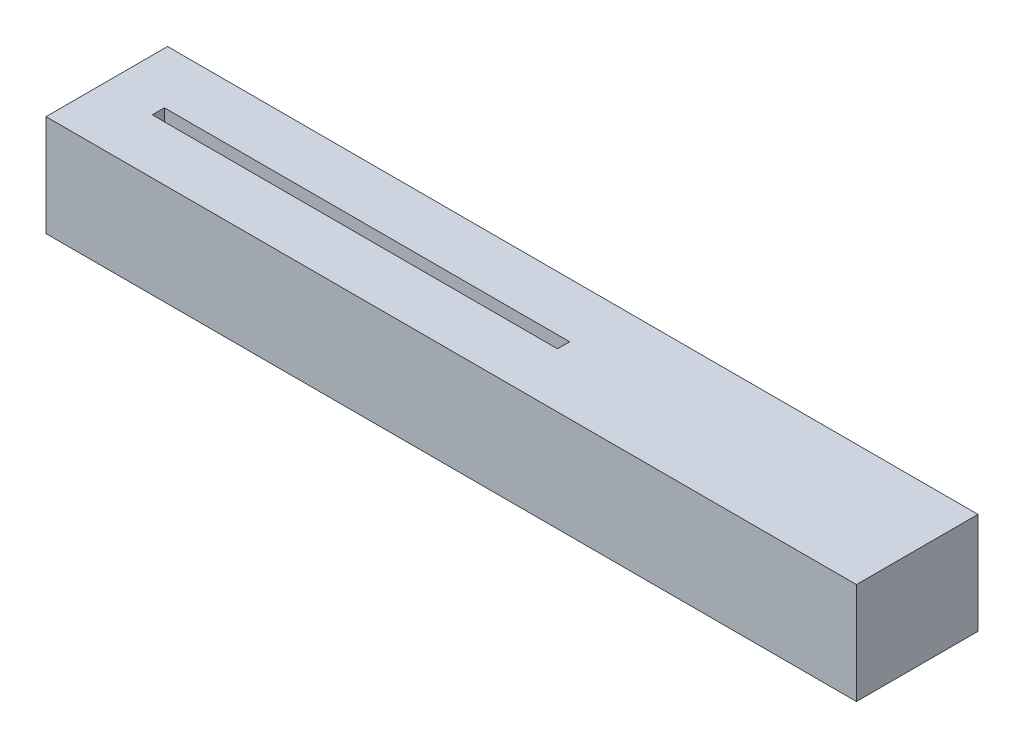
ISO-10303-21;
HEADER;
FILE_DESCRIPTION(('STEP AP214'),'2;1');
FILE_NAME('part.step','',(''),(''),'','','');
FILE_SCHEMA(('AUTOMOTIVE_DESIGN { 1 0 10303 214 1 1 1 1 }'));
ENDSEC;
DATA;
#1=APPLICATION_CONTEXT('core data for automotive mechanical design processes');
#2=APPLICATION_PROTOCOL_DEFINITION('international standard','automotive_design',2000,#1);
#3=PRODUCT_CONTEXT('',#1,'mechanical');
#4=PRODUCT('Part','Part','',(#3));
#5=PRODUCT_RELATED_PRODUCT_CATEGORY('part','',(#4));
#6=PRODUCT_DEFINITION_FORMATION('','',#4);
#7=PRODUCT_DEFINITION_CONTEXT('part definition',#1,'design');
#8=PRODUCT_DEFINITION('design','',#6,#7);
#9=PRODUCT_DEFINITION_SHAPE('','',#8);
#10=(LENGTH_UNIT() NAMED_UNIT(*) SI_UNIT(.MILLI.,.METRE.));
#11=(NAMED_UNIT(*) PLANE_ANGLE_UNIT() SI_UNIT($,.RADIAN.));
#12=(NAMED_UNIT(*) SI_UNIT($,.STERADIAN.) SOLID_ANGLE_UNIT());
#13=UNCERTAINTY_MEASURE_WITH_UNIT(LENGTH_MEASURE(1.E-05),#10,'distance_accuracy_value','');
#14=(GEOMETRIC_REPRESENTATION_CONTEXT(3) GLOBAL_UNCERTAINTY_ASSIGNED_CONTEXT((#13)) GLOBAL_UNIT_ASSIGNED_CONTEXT((#10,
#11,#12)) REPRESENTATION_CONTEXT('',''));
#15=CARTESIAN_POINT('',(0.,0.,0.));
#16=DIRECTION('',(0.,0.,1.));
#17=DIRECTION('',(1.,0.,0.));
#18=AXIS2_PLACEMENT_3D('',#15,#16,#17);
#19=CARTESIAN_POINT('',(0.,5.,0.));
#20=DIRECTION('',(-1.,0.,0.));
#21=DIRECTION('',(0.,0.,1.));
#22=AXIS2_PLACEMENT_3D('',#19,#20,#21);
#23=PLANE('',#22);
#24=DIRECTION('',(0.,0.,-1.));
#25=VECTOR('',#24,1.);
#26=CARTESIAN_POINT('',(0.,0.,0.));
#27=LINE('',#26,#25);
#28=CARTESIAN_POINT('',(0.,0.,0.));
#29=VERTEX_POINT('',#28);
#30=CARTESIAN_POINT('',(0.,0.,-6.));
#31=VERTEX_POINT('',#30);
#32=EDGE_CURVE('E152',#29,#31,#27,.T.);
#33=ORIENTED_EDGE('',*,*,#32,.F.);
#34=DIRECTION('',(0.,-1.,0.));
#35=VECTOR('',#34,1.);
#36=CARTESIAN_POINT('',(0.,5.,0.));
#37=LINE('',#36,#35);
#38=CARTESIAN_POINT('',(0.,5.,0.));
#39=VERTEX_POINT('',#38);
#40=EDGE_CURVE('E11',#39,#29,#37,.T.);
#41=ORIENTED_EDGE('',*,*,#40,.F.);
#42=DIRECTION('',(0.,0.,-1.));
#43=VECTOR('',#42,1.);
#44=CARTESIAN_POINT('',(0.,5.,0.));
#45=LINE('',#44,#43);
#46=CARTESIAN_POINT('',(0.,5.,-6.));
#47=VERTEX_POINT('',#46);
#48=EDGE_CURVE('E122',#39,#47,#45,.T.);
#49=ORIENTED_EDGE('',*,*,#48,.T.);
#50=DIRECTION('',(0.,-1.,0.));
#51=VECTOR('',#50,1.);
#52=CARTESIAN_POINT('',(0.,5.,-6.));
#53=LINE('',#52,#51);
#54=EDGE_CURVE('E56',#47,#31,#53,.T.);
#55=ORIENTED_EDGE('',*,*,#54,.T.);
#56=EDGE_LOOP('',(#33,#41,#49,#55));
#57=FACE_BOUND('',#56,.T.);
#58=ADVANCED_FACE('F37',(#57),#23,.T.);
#59=CARTESIAN_POINT('',(0.,5.,0.));
#60=DIRECTION('',(0.,0.,-1.));
#61=DIRECTION('',(-1.,0.,0.));
#62=AXIS2_PLACEMENT_3D('',#59,#60,#61);
#63=PLANE('',#62);
#64=DIRECTION('',(1.,0.,0.));
#65=VECTOR('',#64,1.);
#66=CARTESIAN_POINT('',(0.,0.,0.));
#67=LINE('',#66,#65);
#68=CARTESIAN_POINT('',(40.,0.,0.));
#69=VERTEX_POINT('',#68);
#70=EDGE_CURVE('E127',#29,#69,#67,.T.);
#71=ORIENTED_EDGE('',*,*,#70,.T.);
#72=DIRECTION('',(0.,-1.,0.));
#73=VECTOR('',#72,1.);
#74=CARTESIAN_POINT('',(40.,5.,0.));
#75=LINE('',#74,#73);
#76=CARTESIAN_POINT('',(40.,5.,0.));
#77=VERTEX_POINT('',#76);
#78=EDGE_CURVE('E47',#77,#69,#75,.T.);
#79=ORIENTED_EDGE('',*,*,#78,.F.);
#80=DIRECTION('',(1.,0.,0.));
#81=VECTOR('',#80,1.);
#82=CARTESIAN_POINT('',(0.,5.,0.));
#83=LINE('',#82,#81);
#84=EDGE_CURVE('E117',#39,#77,#83,.T.);
#85=ORIENTED_EDGE('',*,*,#84,.F.);
#86=ORIENTED_EDGE('',*,*,#40,.T.);
#87=EDGE_LOOP('',(#71,#79,#85,#86));
#88=FACE_BOUND('',#87,.T.);
#89=ADVANCED_FACE('F125',(#88),#63,.F.);
#90=CARTESIAN_POINT('',(40.,5.,0.));
#91=DIRECTION('',(-1.,0.,0.));
#92=DIRECTION('',(0.,0.,1.));
#93=AXIS2_PLACEMENT_3D('',#90,#91,#92);
#94=PLANE('',#93);
#95=DIRECTION('',(0.,0.,-1.));
#96=VECTOR('',#95,1.);
#97=CARTESIAN_POINT('',(40.,0.,0.));
#98=LINE('',#97,#96);
#99=CARTESIAN_POINT('',(40.,0.,-6.));
#100=VERTEX_POINT('',#99);
#101=EDGE_CURVE('E149',#69,#100,#98,.T.);
#102=ORIENTED_EDGE('',*,*,#101,.T.);
#103=DIRECTION('',(0.,-1.,0.));
#104=VECTOR('',#103,1.);
#105=CARTESIAN_POINT('',(40.,5.,-6.));
#106=LINE('',#105,#104);
#107=CARTESIAN_POINT('',(40.,5.,-6.));
#108=VERTEX_POINT('',#107);
#109=EDGE_CURVE('E82',#108,#100,#106,.T.);
#110=ORIENTED_EDGE('',*,*,#109,.F.);
#111=DIRECTION('',(0.,0.,-1.));
#112=VECTOR('',#111,1.);
#113=CARTESIAN_POINT('',(40.,5.,0.));
#114=LINE('',#113,#112);
#115=EDGE_CURVE('E109',#77,#108,#114,.T.);
#116=ORIENTED_EDGE('',*,*,#115,.F.);
#117=ORIENTED_EDGE('',*,*,#78,.T.);
#118=EDGE_LOOP('',(#102,#110,#116,#117));
#119=FACE_BOUND('',#118,.T.);
#120=ADVANCED_FACE('F111',(#119),#94,.F.);
#121=CARTESIAN_POINT('',(0.,5.,-2.7));
#122=DIRECTION('',(0.,0.,-1.));
#123=DIRECTION('',(-1.,0.,0.));
#124=AXIS2_PLACEMENT_3D('',#121,#122,#123);
#125=PLANE('',#124);
#126=DIRECTION('',(1.,0.,0.));
#127=VECTOR('',#126,1.);
#128=CARTESIAN_POINT('',(0.,0.,-2.7));
#129=LINE('',#128,#127);
#130=CARTESIAN_POINT('',(2.54432125608404,0.,-2.7));
#131=VERTEX_POINT('',#130);
#132=CARTESIAN_POINT('',(22.544321256084,0.,-2.7));
#133=VERTEX_POINT('',#132);
#134=EDGE_CURVE('E161',#131,#133,#129,.T.);
#135=ORIENTED_EDGE('',*,*,#134,.F.);
#136=DIRECTION('',(0.,-1.,0.));
#137=VECTOR('',#136,1.);
#138=CARTESIAN_POINT('',(2.54432125608404,5.,-2.7));
#139=LINE('',#138,#137);
#140=CARTESIAN_POINT('',(2.54432125608404,5.,-2.7));
#141=VERTEX_POINT('',#140);
#142=EDGE_CURVE('E41',#141,#131,#139,.T.);
#143=ORIENTED_EDGE('',*,*,#142,.F.);
#144=DIRECTION('',(1.,0.,0.));
#145=VECTOR('',#144,1.);
#146=CARTESIAN_POINT('',(0.,5.,-2.7));
#147=LINE('',#146,#145);
#148=CARTESIAN_POINT('',(22.544321256084,5.,-2.7));
#149=VERTEX_POINT('',#148);
#150=EDGE_CURVE('E148',#141,#149,#147,.T.);
#151=ORIENTED_EDGE('',*,*,#150,.T.);
#152=DIRECTION('',(0.,-1.,0.));
#153=VECTOR('',#152,1.);
#154=CARTESIAN_POINT('',(22.544321256084,5.,-2.7));
#155=LINE('',#154,#153);
#156=EDGE_CURVE('E132',#149,#133,#155,.T.);
#157=ORIENTED_EDGE('',*,*,#156,.T.);
#158=EDGE_LOOP('',(#135,#143,#151,#157));
#159=FACE_BOUND('',#158,.T.);
#160=ADVANCED_FACE('F39',(#159),#125,.T.);
#161=CARTESIAN_POINT('',(2.54432125608404,5.,0.));
#162=DIRECTION('',(-1.,0.,0.));
#163=DIRECTION('',(0.,0.,1.));
#164=AXIS2_PLACEMENT_3D('',#161,#162,#163);
#165=PLANE('',#164);
#166=DIRECTION('',(0.,0.,-1.));
#167=VECTOR('',#166,1.);
#168=CARTESIAN_POINT('',(2.54432125608404,0.,0.));
#169=LINE('',#168,#167);
#170=CARTESIAN_POINT('',(2.54432125608404,0.,-3.3));
#171=VERTEX_POINT('',#170);
#172=EDGE_CURVE('E159',#131,#171,#169,.T.);
#173=ORIENTED_EDGE('',*,*,#172,.T.);
#174=DIRECTION('',(0.,-1.,0.));
#175=VECTOR('',#174,1.);
#176=CARTESIAN_POINT('',(2.54432125608404,5.,-3.3));
#177=LINE('',#176,#175);
#178=CARTESIAN_POINT('',(2.54432125608404,5.,-3.3));
#179=VERTEX_POINT('',#178);
#180=EDGE_CURVE('E135',#179,#171,#177,.T.);
#181=ORIENTED_EDGE('',*,*,#180,.F.);
#182=DIRECTION('',(0.,0.,-1.));
#183=VECTOR('',#182,1.);
#184=CARTESIAN_POINT('',(2.54432125608404,5.,0.));
#185=LINE('',#184,#183);
#186=EDGE_CURVE('E171',#141,#179,#185,.T.);
#187=ORIENTED_EDGE('',*,*,#186,.F.);
#188=ORIENTED_EDGE('',*,*,#142,.T.);
#189=EDGE_LOOP('',(#173,#181,#187,#188));
#190=FACE_BOUND('',#189,.T.);
#191=ADVANCED_FACE('F183',(#190),#165,.F.);
#192=CARTESIAN_POINT('',(0.,5.,-3.3));
#193=DIRECTION('',(0.,0.,-1.));
#194=DIRECTION('',(-1.,0.,0.));
#195=AXIS2_PLACEMENT_3D('',#192,#193,#194);
#196=PLANE('',#195);
#197=DIRECTION('',(1.,0.,0.));
#198=VECTOR('',#197,1.);
#199=CARTESIAN_POINT('',(0.,0.,-3.3));
#200=LINE('',#199,#198);
#201=CARTESIAN_POINT('',(22.544321256084,0.,-3.3));
#202=VERTEX_POINT('',#201);
#203=EDGE_CURVE('E157',#171,#202,#200,.T.);
#204=ORIENTED_EDGE('',*,*,#203,.T.);
#205=DIRECTION('',(0.,-1.,0.));
#206=VECTOR('',#205,1.);
#207=CARTESIAN_POINT('',(22.544321256084,5.,-3.3));
#208=LINE('',#207,#206);
#209=CARTESIAN_POINT('',(22.544321256084,5.,-3.3));
#210=VERTEX_POINT('',#209);
#211=EDGE_CURVE('E134',#210,#202,#208,.T.);
#212=ORIENTED_EDGE('',*,*,#211,.F.);
#213=DIRECTION('',(1.,0.,0.));
#214=VECTOR('',#213,1.);
#215=CARTESIAN_POINT('',(0.,5.,-3.3));
#216=LINE('',#215,#214);
#217=EDGE_CURVE('E169',#179,#210,#216,.T.);
#218=ORIENTED_EDGE('',*,*,#217,.F.);
#219=ORIENTED_EDGE('',*,*,#180,.T.);
#220=EDGE_LOOP('',(#204,#212,#218,#219));
#221=FACE_BOUND('',#220,.T.);
#222=ADVANCED_FACE('F184',(#221),#196,.F.);
#223=CARTESIAN_POINT('',(22.544321256084,5.,0.));
#224=DIRECTION('',(-1.,0.,0.));
#225=DIRECTION('',(0.,0.,1.));
#226=AXIS2_PLACEMENT_3D('',#223,#224,#225);
#227=PLANE('',#226);
#228=DIRECTION('',(0.,0.,-1.));
#229=VECTOR('',#228,1.);
#230=CARTESIAN_POINT('',(22.544321256084,0.,0.));
#231=LINE('',#230,#229);
#232=EDGE_CURVE('E154',#133,#202,#231,.T.);
#233=ORIENTED_EDGE('',*,*,#232,.F.);
#234=ORIENTED_EDGE('',*,*,#156,.F.);
#235=DIRECTION('',(0.,0.,-1.));
#236=VECTOR('',#235,1.);
#237=CARTESIAN_POINT('',(22.544321256084,5.,0.));
#238=LINE('',#237,#236);
#239=EDGE_CURVE('E166',#149,#210,#238,.T.);
#240=ORIENTED_EDGE('',*,*,#239,.T.);
#241=ORIENTED_EDGE('',*,*,#211,.T.);
#242=EDGE_LOOP('',(#233,#234,#240,#241));
#243=FACE_BOUND('',#242,.T.);
#244=ADVANCED_FACE('F179',(#243),#227,.T.);
#245=CARTESIAN_POINT('',(0.,5.,-6.));
#246=DIRECTION('',(0.,0.,-1.));
#247=DIRECTION('',(-1.,0.,0.));
#248=AXIS2_PLACEMENT_3D('',#245,#246,#247);
#249=PLANE('',#248);
#250=DIRECTION('',(1.,0.,0.));
#251=VECTOR('',#250,1.);
#252=CARTESIAN_POINT('',(0.,0.,-6.));
#253=LINE('',#252,#251);
#254=EDGE_CURVE('E145',#31,#100,#253,.T.);
#255=ORIENTED_EDGE('',*,*,#254,.F.);
#256=ORIENTED_EDGE('',*,*,#54,.F.);
#257=DIRECTION('',(1.,0.,0.));
#258=VECTOR('',#257,1.);
#259=CARTESIAN_POINT('',(0.,5.,-6.));
#260=LINE('',#259,#258);
#261=EDGE_CURVE('E116',#47,#108,#260,.T.);
#262=ORIENTED_EDGE('',*,*,#261,.T.);
#263=ORIENTED_EDGE('',*,*,#109,.T.);
#264=EDGE_LOOP('',(#255,#256,#262,#263));
#265=FACE_BOUND('',#264,.T.);
#266=ADVANCED_FACE('F191',(#265),#249,.T.);
#267=CARTESIAN_POINT('',(0.,5.,0.));
#268=DIRECTION('',(0.,1.,0.));
#269=DIRECTION('',(0.,0.,1.));
#270=AXIS2_PLACEMENT_3D('',#267,#268,#269);
#271=PLANE('',#270);
#272=ORIENTED_EDGE('',*,*,#150,.F.);
#273=ORIENTED_EDGE('',*,*,#186,.T.);
#274=ORIENTED_EDGE('',*,*,#217,.T.);
#275=ORIENTED_EDGE('',*,*,#239,.F.);
#276=EDGE_LOOP('',(#272,#273,#274,#275));
#277=FACE_BOUND('',#276,.T.);
#278=ORIENTED_EDGE('',*,*,#48,.F.);
#279=ORIENTED_EDGE('',*,*,#84,.T.);
#280=ORIENTED_EDGE('',*,*,#115,.T.);
#281=ORIENTED_EDGE('',*,*,#261,.F.);
#282=EDGE_LOOP('',(#278,#279,#280,#281));
#283=FACE_BOUND('',#282,.T.);
#284=ADVANCED_FACE('F121',(#277,#283),#271,.T.);
#285=CARTESIAN_POINT('',(0.,0.,0.));
#286=DIRECTION('',(0.,1.,0.));
#287=DIRECTION('',(0.,0.,1.));
#288=AXIS2_PLACEMENT_3D('',#285,#286,#287);
#289=PLANE('',#288);
#290=ORIENTED_EDGE('',*,*,#134,.T.);
#291=ORIENTED_EDGE('',*,*,#232,.T.);
#292=ORIENTED_EDGE('',*,*,#203,.F.);
#293=ORIENTED_EDGE('',*,*,#172,.F.);
#294=EDGE_LOOP('',(#290,#291,#292,#293));
#295=FACE_BOUND('',#294,.T.);
#296=ORIENTED_EDGE('',*,*,#32,.T.);
#297=ORIENTED_EDGE('',*,*,#254,.T.);
#298=ORIENTED_EDGE('',*,*,#101,.F.);
#299=ORIENTED_EDGE('',*,*,#70,.F.);
#300=EDGE_LOOP('',(#296,#297,#298,#299));
#301=FACE_BOUND('',#300,.T.);
#302=ADVANCED_FACE('F181',(#295,#301),#289,.F.);
#303=CLOSED_SHELL('',(#58,#89,#120,#160,#191,#222,#244,#266,#284,#302));
#304=MANIFOLD_SOLID_BREP('B2',#303);
#305=ADVANCED_BREP_SHAPE_REPRESENTATION('',(#18,#304),#14);
#306=SHAPE_DEFINITION_REPRESENTATION(#9,#305);
ENDSEC;
END-ISO-10303-21;
